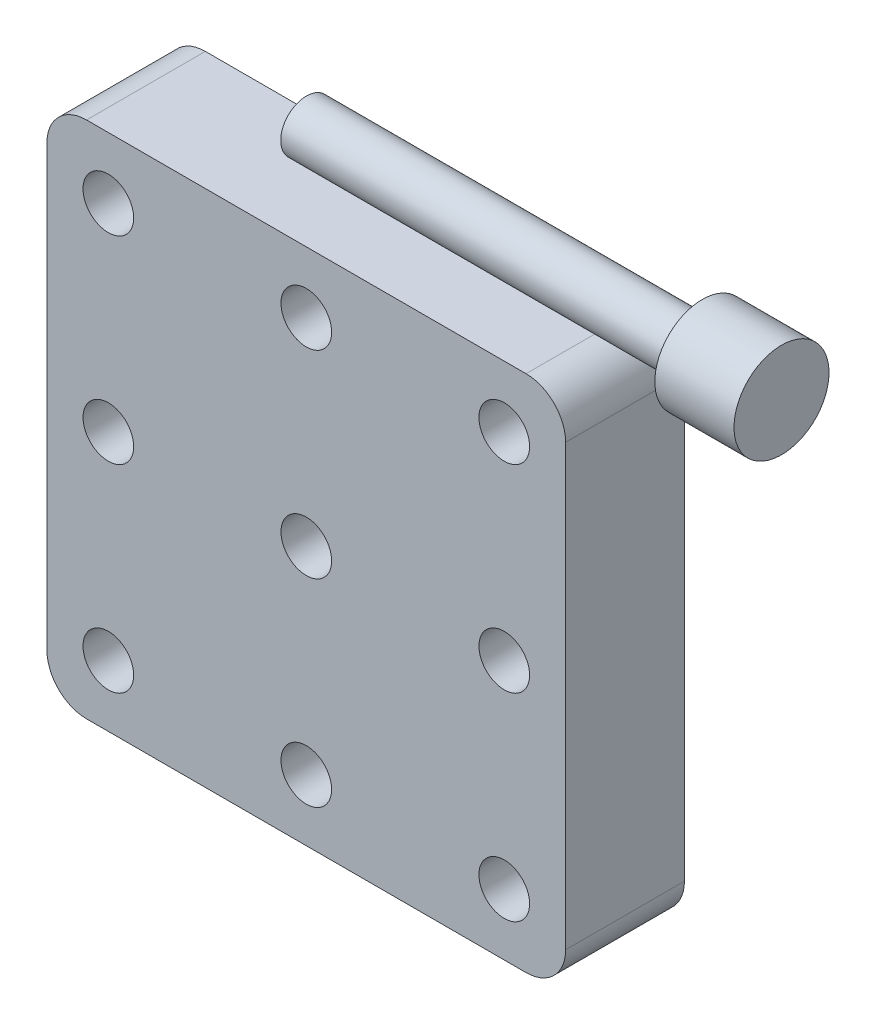
ISO-10303-21;
HEADER;
FILE_DESCRIPTION(('STEP AP214'),'2;1');
FILE_NAME('part.step','',(''),(''),'','','');
FILE_SCHEMA(('AUTOMOTIVE_DESIGN { 1 0 10303 214 1 1 1 1 }'));
ENDSEC;
DATA;
#1=APPLICATION_CONTEXT('core data for automotive mechanical design processes');
#2=APPLICATION_PROTOCOL_DEFINITION('international standard','automotive_design',2000,#1);
#3=PRODUCT_CONTEXT('',#1,'mechanical');
#4=PRODUCT('Part','Part','',(#3));
#5=PRODUCT_RELATED_PRODUCT_CATEGORY('part','',(#4));
#6=PRODUCT_DEFINITION_FORMATION('','',#4);
#7=PRODUCT_DEFINITION_CONTEXT('part definition',#1,'design');
#8=PRODUCT_DEFINITION('design','',#6,#7);
#9=PRODUCT_DEFINITION_SHAPE('','',#8);
#10=(LENGTH_UNIT() NAMED_UNIT(*) SI_UNIT(.MILLI.,.METRE.));
#11=(NAMED_UNIT(*) PLANE_ANGLE_UNIT() SI_UNIT($,.RADIAN.));
#12=(NAMED_UNIT(*) SI_UNIT($,.STERADIAN.) SOLID_ANGLE_UNIT());
#13=UNCERTAINTY_MEASURE_WITH_UNIT(LENGTH_MEASURE(1.E-05),#10,'distance_accuracy_value','');
#14=(GEOMETRIC_REPRESENTATION_CONTEXT(3) GLOBAL_UNCERTAINTY_ASSIGNED_CONTEXT((#13)) GLOBAL_UNIT_ASSIGNED_CONTEXT((#10,
#11,#12)) REPRESENTATION_CONTEXT('',''));
#15=CARTESIAN_POINT('',(0.,0.,0.));
#16=DIRECTION('',(0.,0.,1.));
#17=DIRECTION('',(1.,0.,0.));
#18=AXIS2_PLACEMENT_3D('',#15,#16,#17);
#19=CARTESIAN_POINT('',(-10.,35.9950447421009,9.98803609831382));
#20=DIRECTION('',(1.,0.,0.));
#21=DIRECTION('',(0.,0.,-1.));
#22=AXIS2_PLACEMENT_3D('',#19,#20,#21);
#23=CYLINDRICAL_SURFACE('',#22,3.24504474210088);
#24=CARTESIAN_POINT('',(-10.,35.9950447421009,9.98803609831382));
#25=DIRECTION('',(1.,0.,0.));
#26=DIRECTION('',(0.,0.,-1.));
#27=AXIS2_PLACEMENT_3D('',#24,#25,#26);
#28=CIRCLE('',#27,3.24504474210088);
#29=CARTESIAN_POINT('',(-10.,35.9950447421009,6.74299135621294));
#30=VERTEX_POINT('',#29);
#31=EDGE_CURVE('E11',#30,#30,#28,.T.);
#32=ORIENTED_EDGE('',*,*,#31,.T.);
#33=EDGE_LOOP('',(#32));
#34=FACE_BOUND('',#33,.T.);
#35=CARTESIAN_POINT('',(40.,35.9950447421009,9.98803609831382));
#36=DIRECTION('',(1.,0.,0.));
#37=DIRECTION('',(0.,0.,-1.));
#38=AXIS2_PLACEMENT_3D('',#35,#36,#37);
#39=CIRCLE('',#38,3.24504474210088);
#40=CARTESIAN_POINT('',(40.,35.9950447421009,6.74299135621294));
#41=VERTEX_POINT('',#40);
#42=EDGE_CURVE('E47',#41,#41,#39,.T.);
#43=ORIENTED_EDGE('',*,*,#42,.F.);
#44=EDGE_LOOP('',(#43));
#45=FACE_BOUND('',#44,.T.);
#46=ADVANCED_FACE('F41',(#34,#45),#23,.T.);
#47=CARTESIAN_POINT('',(-10.,35.9950447421009,9.98803609831382));
#48=DIRECTION('',(1.,0.,0.));
#49=DIRECTION('',(0.,0.,-1.));
#50=AXIS2_PLACEMENT_3D('',#47,#48,#49);
#51=PLANE('',#50);
#52=ORIENTED_EDGE('',*,*,#31,.F.);
#53=EDGE_LOOP('',(#52));
#54=FACE_BOUND('',#53,.T.);
#55=ADVANCED_FACE('F74',(#54),#51,.F.);
#56=CARTESIAN_POINT('',(50.,35.9950447421009,9.98803609831382));
#57=DIRECTION('',(-1.,0.,0.));
#58=DIRECTION('',(0.,0.,1.));
#59=AXIS2_PLACEMENT_3D('',#56,#57,#58);
#60=CYLINDRICAL_SURFACE('',#59,6.);
#61=CARTESIAN_POINT('',(50.,35.9950447421009,9.98803609831382));
#62=DIRECTION('',(1.,0.,0.));
#63=DIRECTION('',(0.,0.,-1.));
#64=AXIS2_PLACEMENT_3D('',#61,#62,#63);
#65=CIRCLE('',#64,6.);
#66=CARTESIAN_POINT('',(50.,35.9950447421009,3.98803609831382));
#67=VERTEX_POINT('',#66);
#68=EDGE_CURVE('E51',#67,#67,#65,.T.);
#69=ORIENTED_EDGE('',*,*,#68,.F.);
#70=EDGE_LOOP('',(#69));
#71=FACE_BOUND('',#70,.T.);
#72=CARTESIAN_POINT('',(40.,35.9950447421009,9.98803609831382));
#73=DIRECTION('',(1.,0.,0.));
#74=DIRECTION('',(0.,0.,-1.));
#75=AXIS2_PLACEMENT_3D('',#72,#73,#74);
#76=CIRCLE('',#75,6.);
#77=CARTESIAN_POINT('',(40.,35.9950447421009,3.98803609831382));
#78=VERTEX_POINT('',#77);
#79=EDGE_CURVE('E55',#78,#78,#76,.T.);
#80=ORIENTED_EDGE('',*,*,#79,.T.);
#81=EDGE_LOOP('',(#80));
#82=FACE_BOUND('',#81,.T.);
#83=ADVANCED_FACE('F61',(#71,#82),#60,.T.);
#84=CARTESIAN_POINT('',(50.,35.9950447421009,9.98803609831382));
#85=DIRECTION('',(1.,0.,0.));
#86=DIRECTION('',(0.,0.,-1.));
#87=AXIS2_PLACEMENT_3D('',#84,#85,#86);
#88=PLANE('',#87);
#89=ORIENTED_EDGE('',*,*,#68,.T.);
#90=EDGE_LOOP('',(#89));
#91=FACE_BOUND('',#90,.T.);
#92=ADVANCED_FACE('F65',(#91),#88,.T.);
#93=CARTESIAN_POINT('',(40.,35.9950447421009,9.98803609831382));
#94=DIRECTION('',(1.,0.,0.));
#95=DIRECTION('',(0.,0.,-1.));
#96=AXIS2_PLACEMENT_3D('',#93,#94,#95);
#97=PLANE('',#96);
#98=ORIENTED_EDGE('',*,*,#42,.T.);
#99=EDGE_LOOP('',(#98));
#100=FACE_BOUND('',#99,.T.);
#101=ORIENTED_EDGE('',*,*,#79,.F.);
#102=EDGE_LOOP('',(#101));
#103=FACE_BOUND('',#102,.T.);
#104=ADVANCED_FACE('F63',(#100,#103),#97,.F.);
#105=CLOSED_SHELL('',(#46,#55,#83,#92,#104));
#106=MANIFOLD_SOLID_BREP('B2',#105);
#107=CARTESIAN_POINT('',(-32.75,-32.75,20.));
#108=DIRECTION('',(-1.,0.,0.));
#109=DIRECTION('',(0.,0.,1.));
#110=AXIS2_PLACEMENT_3D('',#107,#108,#109);
#111=PLANE('',#110);
#112=DIRECTION('',(0.,0.,-1.));
#113=VECTOR('',#112,1.);
#114=CARTESIAN_POINT('',(-32.75,27.75,20.));
#115=LINE('',#114,#113);
#116=CARTESIAN_POINT('',(-32.75,27.75,20.));
#117=VERTEX_POINT('',#116);
#118=CARTESIAN_POINT('',(-32.75,27.75,5.));
#119=VERTEX_POINT('',#118);
#120=EDGE_CURVE('E195',#117,#119,#115,.T.);
#121=ORIENTED_EDGE('',*,*,#120,.T.);
#122=DIRECTION('',(0.,1.,0.));
#123=VECTOR('',#122,1.);
#124=CARTESIAN_POINT('',(-32.75,32.75,5.));
#125=LINE('',#124,#123);
#126=CARTESIAN_POINT('',(-32.75,-27.75,5.));
#127=VERTEX_POINT('',#126);
#128=EDGE_CURVE('E127',#127,#119,#125,.T.);
#129=ORIENTED_EDGE('',*,*,#128,.F.);
#130=DIRECTION('',(0.,0.,-1.));
#131=VECTOR('',#130,1.);
#132=CARTESIAN_POINT('',(-32.75,-27.75,20.));
#133=LINE('',#132,#131);
#134=CARTESIAN_POINT('',(-32.75,-27.75,20.));
#135=VERTEX_POINT('',#134);
#136=EDGE_CURVE('E192',#127,#135,#133,.F.);
#137=ORIENTED_EDGE('',*,*,#136,.T.);
#138=DIRECTION('',(0.,1.,0.));
#139=VECTOR('',#138,1.);
#140=CARTESIAN_POINT('',(-32.75,-32.75,20.));
#141=LINE('',#140,#139);
#142=EDGE_CURVE('E226',#135,#117,#141,.T.);
#143=ORIENTED_EDGE('',*,*,#142,.T.);
#144=EDGE_LOOP('',(#121,#129,#137,#143));
#145=FACE_BOUND('',#144,.T.);
#146=ADVANCED_FACE('F112',(#145),#111,.T.);
#147=CARTESIAN_POINT('',(-32.75,-32.75,20.));
#148=DIRECTION('',(0.,1.,0.));
#149=DIRECTION('',(0.,0.,1.));
#150=AXIS2_PLACEMENT_3D('',#147,#148,#149);
#151=PLANE('',#150);
#152=DIRECTION('',(-1.,0.,0.));
#153=VECTOR('',#152,1.);
#154=CARTESIAN_POINT('',(32.75,-32.75,5.));
#155=LINE('',#154,#153);
#156=CARTESIAN_POINT('',(27.75,-32.75,5.));
#157=VERTEX_POINT('',#156);
#158=CARTESIAN_POINT('',(-27.75,-32.75,5.));
#159=VERTEX_POINT('',#158);
#160=EDGE_CURVE('E181',#157,#159,#155,.T.);
#161=ORIENTED_EDGE('',*,*,#160,.F.);
#162=DIRECTION('',(0.,0.,-1.));
#163=VECTOR('',#162,1.);
#164=CARTESIAN_POINT('',(27.75,-32.75,20.));
#165=LINE('',#164,#163);
#166=CARTESIAN_POINT('',(27.75,-32.75,20.));
#167=VERTEX_POINT('',#166);
#168=EDGE_CURVE('E272',#157,#167,#165,.F.);
#169=ORIENTED_EDGE('',*,*,#168,.T.);
#170=DIRECTION('',(1.,0.,0.));
#171=VECTOR('',#170,1.);
#172=CARTESIAN_POINT('',(-32.75,-32.75,20.));
#173=LINE('',#172,#171);
#174=CARTESIAN_POINT('',(-27.75,-32.75,20.));
#175=VERTEX_POINT('',#174);
#176=EDGE_CURVE('E269',#175,#167,#173,.T.);
#177=ORIENTED_EDGE('',*,*,#176,.F.);
#178=DIRECTION('',(0.,0.,-1.));
#179=VECTOR('',#178,1.);
#180=CARTESIAN_POINT('',(-27.75,-32.75,0.));
#181=LINE('',#180,#179);
#182=EDGE_CURVE('E204',#175,#159,#181,.T.);
#183=ORIENTED_EDGE('',*,*,#182,.T.);
#184=EDGE_LOOP('',(#161,#169,#177,#183));
#185=FACE_BOUND('',#184,.T.);
#186=ADVANCED_FACE('F275',(#185),#151,.F.);
#187=CARTESIAN_POINT('',(32.75,-32.75,20.));
#188=DIRECTION('',(-1.,0.,0.));
#189=DIRECTION('',(0.,0.,1.));
#190=AXIS2_PLACEMENT_3D('',#187,#188,#189);
#191=PLANE('',#190);
#192=DIRECTION('',(0.,-1.,0.));
#193=VECTOR('',#192,1.);
#194=CARTESIAN_POINT('',(32.75,32.75,5.));
#195=LINE('',#194,#193);
#196=CARTESIAN_POINT('',(32.75,27.75,5.));
#197=VERTEX_POINT('',#196);
#198=CARTESIAN_POINT('',(32.75,-27.75,5.));
#199=VERTEX_POINT('',#198);
#200=EDGE_CURVE('E285',#197,#199,#195,.T.);
#201=ORIENTED_EDGE('',*,*,#200,.F.);
#202=DIRECTION('',(0.,0.,-1.));
#203=VECTOR('',#202,1.);
#204=CARTESIAN_POINT('',(32.75,27.75,20.));
#205=LINE('',#204,#203);
#206=CARTESIAN_POINT('',(32.75,27.75,20.));
#207=VERTEX_POINT('',#206);
#208=EDGE_CURVE('E212',#197,#207,#205,.F.);
#209=ORIENTED_EDGE('',*,*,#208,.T.);
#210=DIRECTION('',(0.,1.,0.));
#211=VECTOR('',#210,1.);
#212=CARTESIAN_POINT('',(32.75,-32.75,20.));
#213=LINE('',#212,#211);
#214=CARTESIAN_POINT('',(32.75,-27.75,20.));
#215=VERTEX_POINT('',#214);
#216=EDGE_CURVE('E225',#215,#207,#213,.T.);
#217=ORIENTED_EDGE('',*,*,#216,.F.);
#218=DIRECTION('',(0.,0.,-1.));
#219=VECTOR('',#218,1.);
#220=CARTESIAN_POINT('',(32.75,-27.75,20.));
#221=LINE('',#220,#219);
#222=EDGE_CURVE('E214',#215,#199,#221,.T.);
#223=ORIENTED_EDGE('',*,*,#222,.T.);
#224=EDGE_LOOP('',(#201,#209,#217,#223));
#225=FACE_BOUND('',#224,.T.);
#226=ADVANCED_FACE('F284',(#225),#191,.F.);
#227=CARTESIAN_POINT('',(-32.75,32.75,20.));
#228=DIRECTION('',(0.,1.,0.));
#229=DIRECTION('',(0.,0.,1.));
#230=AXIS2_PLACEMENT_3D('',#227,#228,#229);
#231=PLANE('',#230);
#232=DIRECTION('',(0.,0.,-1.));
#233=VECTOR('',#232,1.);
#234=CARTESIAN_POINT('',(27.75,32.75,0.));
#235=LINE('',#234,#233);
#236=CARTESIAN_POINT('',(27.75,32.75,20.));
#237=VERTEX_POINT('',#236);
#238=CARTESIAN_POINT('',(27.75,32.75,5.));
#239=VERTEX_POINT('',#238);
#240=EDGE_CURVE('E39',#237,#239,#235,.T.);
#241=ORIENTED_EDGE('',*,*,#240,.T.);
#242=DIRECTION('',(1.,0.,0.));
#243=VECTOR('',#242,1.);
#244=CARTESIAN_POINT('',(32.75,32.75,5.));
#245=LINE('',#244,#243);
#246=CARTESIAN_POINT('',(-27.75,32.75,5.));
#247=VERTEX_POINT('',#246);
#248=EDGE_CURVE('E196',#247,#239,#245,.T.);
#249=ORIENTED_EDGE('',*,*,#248,.F.);
#250=DIRECTION('',(0.,0.,-1.));
#251=VECTOR('',#250,1.);
#252=CARTESIAN_POINT('',(-27.75,32.75,20.));
#253=LINE('',#252,#251);
#254=CARTESIAN_POINT('',(-27.75,32.75,20.));
#255=VERTEX_POINT('',#254);
#256=EDGE_CURVE('E120',#247,#255,#253,.F.);
#257=ORIENTED_EDGE('',*,*,#256,.T.);
#258=DIRECTION('',(1.,0.,0.));
#259=VECTOR('',#258,1.);
#260=CARTESIAN_POINT('',(-32.75,32.75,20.));
#261=LINE('',#260,#259);
#262=EDGE_CURVE('E220',#255,#237,#261,.T.);
#263=ORIENTED_EDGE('',*,*,#262,.T.);
#264=EDGE_LOOP('',(#241,#249,#257,#263));
#265=FACE_BOUND('',#264,.T.);
#266=ADVANCED_FACE('F219',(#265),#231,.T.);
#267=CARTESIAN_POINT('',(-27.75,-27.75,20.));
#268=DIRECTION('',(0.,0.,1.));
#269=DIRECTION('',(1.,0.,0.));
#270=AXIS2_PLACEMENT_3D('',#267,#268,#269);
#271=CYLINDRICAL_SURFACE('',#270,5.);
#272=ORIENTED_EDGE('',*,*,#136,.F.);
#273=CARTESIAN_POINT('',(-27.75,-27.75,5.));
#274=DIRECTION('',(0.,0.,-1.));
#275=DIRECTION('',(-1.,0.,0.));
#276=AXIS2_PLACEMENT_3D('',#273,#274,#275);
#277=CIRCLE('',#276,5.);
#278=EDGE_CURVE('E177',#127,#159,#277,.F.);
#279=ORIENTED_EDGE('',*,*,#278,.T.);
#280=ORIENTED_EDGE('',*,*,#182,.F.);
#281=CARTESIAN_POINT('',(-27.75,-27.75,20.));
#282=DIRECTION('',(0.,0.,-1.));
#283=DIRECTION('',(-1.,0.,0.));
#284=AXIS2_PLACEMENT_3D('',#281,#282,#283);
#285=CIRCLE('',#284,5.);
#286=EDGE_CURVE('E200',#135,#175,#285,.F.);
#287=ORIENTED_EDGE('',*,*,#286,.F.);
#288=EDGE_LOOP('',(#272,#279,#280,#287));
#289=FACE_BOUND('',#288,.T.);
#290=ADVANCED_FACE('F199',(#289),#271,.T.);
#291=CARTESIAN_POINT('',(27.75,-27.75,20.));
#292=DIRECTION('',(0.,0.,-1.));
#293=DIRECTION('',(-1.,0.,0.));
#294=AXIS2_PLACEMENT_3D('',#291,#292,#293);
#295=CYLINDRICAL_SURFACE('',#294,5.);
#296=ORIENTED_EDGE('',*,*,#168,.F.);
#297=CARTESIAN_POINT('',(27.75,-27.75,5.));
#298=DIRECTION('',(0.,0.,-1.));
#299=DIRECTION('',(-1.,0.,0.));
#300=AXIS2_PLACEMENT_3D('',#297,#298,#299);
#301=CIRCLE('',#300,5.);
#302=EDGE_CURVE('E187',#157,#199,#301,.F.);
#303=ORIENTED_EDGE('',*,*,#302,.T.);
#304=ORIENTED_EDGE('',*,*,#222,.F.);
#305=CARTESIAN_POINT('',(27.75,-27.75,20.));
#306=DIRECTION('',(0.,0.,-1.));
#307=DIRECTION('',(-1.,0.,0.));
#308=AXIS2_PLACEMENT_3D('',#305,#306,#307);
#309=CIRCLE('',#308,5.);
#310=EDGE_CURVE('E209',#167,#215,#309,.F.);
#311=ORIENTED_EDGE('',*,*,#310,.F.);
#312=EDGE_LOOP('',(#296,#303,#304,#311));
#313=FACE_BOUND('',#312,.T.);
#314=ADVANCED_FACE('F281',(#313),#295,.T.);
#315=CARTESIAN_POINT('',(27.75,27.75,20.));
#316=DIRECTION('',(0.,0.,1.));
#317=DIRECTION('',(1.,0.,0.));
#318=AXIS2_PLACEMENT_3D('',#315,#316,#317);
#319=CYLINDRICAL_SURFACE('',#318,5.);
#320=ORIENTED_EDGE('',*,*,#208,.F.);
#321=CARTESIAN_POINT('',(27.75,27.75,5.));
#322=DIRECTION('',(0.,0.,-1.));
#323=DIRECTION('',(-1.,0.,0.));
#324=AXIS2_PLACEMENT_3D('',#321,#322,#323);
#325=CIRCLE('',#324,5.);
#326=EDGE_CURVE('E229',#197,#239,#325,.F.);
#327=ORIENTED_EDGE('',*,*,#326,.T.);
#328=ORIENTED_EDGE('',*,*,#240,.F.);
#329=CARTESIAN_POINT('',(27.75,27.75,20.));
#330=DIRECTION('',(0.,0.,-1.));
#331=DIRECTION('',(-1.,0.,0.));
#332=AXIS2_PLACEMENT_3D('',#329,#330,#331);
#333=CIRCLE('',#332,5.);
#334=EDGE_CURVE('E135',#207,#237,#333,.F.);
#335=ORIENTED_EDGE('',*,*,#334,.F.);
#336=EDGE_LOOP('',(#320,#327,#328,#335));
#337=FACE_BOUND('',#336,.T.);
#338=ADVANCED_FACE('F288',(#337),#319,.T.);
#339=CARTESIAN_POINT('',(-27.75,27.75,20.));
#340=DIRECTION('',(0.,0.,-1.));
#341=DIRECTION('',(-1.,0.,0.));
#342=AXIS2_PLACEMENT_3D('',#339,#340,#341);
#343=CYLINDRICAL_SURFACE('',#342,5.);
#344=ORIENTED_EDGE('',*,*,#256,.F.);
#345=CARTESIAN_POINT('',(-27.75,27.75,5.));
#346=DIRECTION('',(0.,0.,-1.));
#347=DIRECTION('',(-1.,0.,0.));
#348=AXIS2_PLACEMENT_3D('',#345,#346,#347);
#349=CIRCLE('',#348,5.);
#350=EDGE_CURVE('E228',#247,#119,#349,.F.);
#351=ORIENTED_EDGE('',*,*,#350,.T.);
#352=ORIENTED_EDGE('',*,*,#120,.F.);
#353=CARTESIAN_POINT('',(-27.75,27.75,20.));
#354=DIRECTION('',(0.,0.,-1.));
#355=DIRECTION('',(-1.,0.,0.));
#356=AXIS2_PLACEMENT_3D('',#353,#354,#355);
#357=CIRCLE('',#356,5.);
#358=EDGE_CURVE('E201',#255,#117,#357,.F.);
#359=ORIENTED_EDGE('',*,*,#358,.F.);
#360=EDGE_LOOP('',(#344,#351,#352,#359));
#361=FACE_BOUND('',#360,.T.);
#362=ADVANCED_FACE('F114',(#361),#343,.T.);
#363=CARTESIAN_POINT('',(25.,-25.,5.));
#364=DIRECTION('',(0.,0.,-1.));
#365=DIRECTION('',(-1.,0.,0.));
#366=AXIS2_PLACEMENT_3D('',#363,#364,#365);
#367=CYLINDRICAL_SURFACE('',#366,3.2);
#368=CARTESIAN_POINT('',(25.,-25.,20.));
#369=DIRECTION('',(0.,0.,1.));
#370=DIRECTION('',(1.,0.,0.));
#371=AXIS2_PLACEMENT_3D('',#368,#369,#370);
#372=CIRCLE('',#371,3.2);
#373=CARTESIAN_POINT('',(28.2,-25.,20.));
#374=VERTEX_POINT('',#373);
#375=EDGE_CURVE('E256',#374,#374,#372,.T.);
#376=ORIENTED_EDGE('',*,*,#375,.T.);
#377=EDGE_LOOP('',(#376));
#378=FACE_BOUND('',#377,.T.);
#379=CARTESIAN_POINT('',(25.,-25.,5.));
#380=DIRECTION('',(0.,0.,-1.));
#381=DIRECTION('',(-1.,0.,0.));
#382=AXIS2_PLACEMENT_3D('',#379,#380,#381);
#383=CIRCLE('',#382,3.2);
#384=CARTESIAN_POINT('',(21.8,-25.,5.));
#385=VERTEX_POINT('',#384);
#386=EDGE_CURVE('E230',#385,#385,#383,.F.);
#387=ORIENTED_EDGE('',*,*,#386,.F.);
#388=EDGE_LOOP('',(#387));
#389=FACE_BOUND('',#388,.T.);
#390=ADVANCED_FACE('F320',(#378,#389),#367,.F.);
#391=CARTESIAN_POINT('',(25.,25.,5.));
#392=DIRECTION('',(0.,0.,-1.));
#393=DIRECTION('',(-1.,0.,0.));
#394=AXIS2_PLACEMENT_3D('',#391,#392,#393);
#395=CYLINDRICAL_SURFACE('',#394,3.2);
#396=CARTESIAN_POINT('',(25.,25.,20.));
#397=DIRECTION('',(0.,0.,1.));
#398=DIRECTION('',(1.,0.,0.));
#399=AXIS2_PLACEMENT_3D('',#396,#397,#398);
#400=CIRCLE('',#399,3.2);
#401=CARTESIAN_POINT('',(28.2,25.,20.));
#402=VERTEX_POINT('',#401);
#403=EDGE_CURVE('E253',#402,#402,#400,.T.);
#404=ORIENTED_EDGE('',*,*,#403,.T.);
#405=EDGE_LOOP('',(#404));
#406=FACE_BOUND('',#405,.T.);
#407=CARTESIAN_POINT('',(25.,25.,5.));
#408=DIRECTION('',(0.,0.,-1.));
#409=DIRECTION('',(-1.,0.,0.));
#410=AXIS2_PLACEMENT_3D('',#407,#408,#409);
#411=CIRCLE('',#410,3.2);
#412=CARTESIAN_POINT('',(21.8,25.,5.));
#413=VERTEX_POINT('',#412);
#414=EDGE_CURVE('E235',#413,#413,#411,.F.);
#415=ORIENTED_EDGE('',*,*,#414,.F.);
#416=EDGE_LOOP('',(#415));
#417=FACE_BOUND('',#416,.T.);
#418=ADVANCED_FACE('F318',(#406,#417),#395,.F.);
#419=CARTESIAN_POINT('',(0.,0.,20.));
#420=DIRECTION('',(0.,0.,-1.));
#421=DIRECTION('',(-1.,0.,0.));
#422=AXIS2_PLACEMENT_3D('',#419,#420,#421);
#423=PLANE('',#422);
#424=CARTESIAN_POINT('',(0.,-1.87822334690851E-13,20.));
#425=DIRECTION('',(0.,0.,1.));
#426=DIRECTION('',(1.,0.,0.));
#427=AXIS2_PLACEMENT_3D('',#424,#425,#426);
#428=CIRCLE('',#427,3.2);
#429=CARTESIAN_POINT('',(3.19999999999999,-1.87822334690851E-13,20.));
#430=VERTEX_POINT('',#429);
#431=EDGE_CURVE('E247',#430,#430,#428,.T.);
#432=ORIENTED_EDGE('',*,*,#431,.F.);
#433=EDGE_LOOP('',(#432));
#434=FACE_BOUND('',#433,.T.);
#435=CARTESIAN_POINT('',(-25.,-25.0000000000004,20.));
#436=DIRECTION('',(0.,0.,1.));
#437=DIRECTION('',(1.,0.,0.));
#438=AXIS2_PLACEMENT_3D('',#435,#436,#437);
#439=CIRCLE('',#438,3.2);
#440=CARTESIAN_POINT('',(-21.8,-25.0000000000004,20.));
#441=VERTEX_POINT('',#440);
#442=EDGE_CURVE('E244',#441,#441,#439,.T.);
#443=ORIENTED_EDGE('',*,*,#442,.F.);
#444=EDGE_LOOP('',(#443));
#445=FACE_BOUND('',#444,.T.);
#446=CARTESIAN_POINT('',(-25.,24.9999999999997,20.));
#447=DIRECTION('',(0.,0.,1.));
#448=DIRECTION('',(1.,0.,0.));
#449=AXIS2_PLACEMENT_3D('',#446,#447,#448);
#450=CIRCLE('',#449,3.2);
#451=CARTESIAN_POINT('',(-21.8,24.9999999999997,20.));
#452=VERTEX_POINT('',#451);
#453=EDGE_CURVE('E241',#452,#452,#450,.T.);
#454=ORIENTED_EDGE('',*,*,#453,.F.);
#455=EDGE_LOOP('',(#454));
#456=FACE_BOUND('',#455,.T.);
#457=CARTESIAN_POINT('',(-25.,-3.62396401633008E-13,20.));
#458=DIRECTION('',(0.,0.,1.));
#459=DIRECTION('',(1.,0.,0.));
#460=AXIS2_PLACEMENT_3D('',#457,#458,#459);
#461=CIRCLE('',#460,3.2);
#462=CARTESIAN_POINT('',(-21.8,-3.62396401633008E-13,20.));
#463=VERTEX_POINT('',#462);
#464=EDGE_CURVE('E186',#463,#463,#461,.T.);
#465=ORIENTED_EDGE('',*,*,#464,.F.);
#466=EDGE_LOOP('',(#465));
#467=FACE_BOUND('',#466,.T.);
#468=CARTESIAN_POINT('',(0.,24.9999999999998,20.));
#469=DIRECTION('',(0.,0.,1.));
#470=DIRECTION('',(1.,0.,0.));
#471=AXIS2_PLACEMENT_3D('',#468,#469,#470);
#472=CIRCLE('',#471,3.2);
#473=CARTESIAN_POINT('',(3.19999999999999,24.9999999999998,20.));
#474=VERTEX_POINT('',#473);
#475=EDGE_CURVE('E250',#474,#474,#472,.T.);
#476=ORIENTED_EDGE('',*,*,#475,.F.);
#477=EDGE_LOOP('',(#476));
#478=FACE_BOUND('',#477,.T.);
#479=CARTESIAN_POINT('',(0.,-25.0000000000002,20.));
#480=DIRECTION('',(0.,0.,1.));
#481=DIRECTION('',(1.,0.,0.));
#482=AXIS2_PLACEMENT_3D('',#479,#480,#481);
#483=CIRCLE('',#482,3.2);
#484=CARTESIAN_POINT('',(3.19999999999999,-25.0000000000002,20.));
#485=VERTEX_POINT('',#484);
#486=EDGE_CURVE('E260',#485,#485,#483,.T.);
#487=ORIENTED_EDGE('',*,*,#486,.F.);
#488=EDGE_LOOP('',(#487));
#489=FACE_BOUND('',#488,.T.);
#490=CARTESIAN_POINT('',(25.,0.,20.));
#491=DIRECTION('',(0.,0.,1.));
#492=DIRECTION('',(1.,0.,0.));
#493=AXIS2_PLACEMENT_3D('',#490,#491,#492);
#494=CIRCLE('',#493,3.2);
#495=CARTESIAN_POINT('',(28.2,0.,20.));
#496=VERTEX_POINT('',#495);
#497=EDGE_CURVE('E257',#496,#496,#494,.T.);
#498=ORIENTED_EDGE('',*,*,#497,.F.);
#499=EDGE_LOOP('',(#498));
#500=FACE_BOUND('',#499,.T.);
#501=ORIENTED_EDGE('',*,*,#403,.F.);
#502=EDGE_LOOP('',(#501));
#503=FACE_BOUND('',#502,.T.);
#504=ORIENTED_EDGE('',*,*,#375,.F.);
#505=EDGE_LOOP('',(#504));
#506=FACE_BOUND('',#505,.T.);
#507=ORIENTED_EDGE('',*,*,#142,.F.);
#508=ORIENTED_EDGE('',*,*,#286,.T.);
#509=ORIENTED_EDGE('',*,*,#176,.T.);
#510=ORIENTED_EDGE('',*,*,#310,.T.);
#511=ORIENTED_EDGE('',*,*,#216,.T.);
#512=ORIENTED_EDGE('',*,*,#334,.T.);
#513=ORIENTED_EDGE('',*,*,#262,.F.);
#514=ORIENTED_EDGE('',*,*,#358,.T.);
#515=EDGE_LOOP('',(#507,#508,#509,#510,#511,#512,#513,#514));
#516=FACE_BOUND('',#515,.T.);
#517=ADVANCED_FACE('F224',(#434,#445,#456,#467,#478,#489,#500,#503,#506,#516),#423,.F.);
#518=CARTESIAN_POINT('',(25.,0.,5.));
#519=DIRECTION('',(0.,0.,1.));
#520=DIRECTION('',(1.,0.,0.));
#521=AXIS2_PLACEMENT_3D('',#518,#519,#520);
#522=CYLINDRICAL_SURFACE('',#521,3.2);
#523=CARTESIAN_POINT('',(25.,0.,5.));
#524=DIRECTION('',(0.,0.,-1.));
#525=DIRECTION('',(-1.,0.,0.));
#526=AXIS2_PLACEMENT_3D('',#523,#524,#525);
#527=CIRCLE('',#526,3.2);
#528=CARTESIAN_POINT('',(21.8,0.,5.));
#529=VERTEX_POINT('',#528);
#530=EDGE_CURVE('E311',#529,#529,#527,.F.);
#531=ORIENTED_EDGE('',*,*,#530,.F.);
#532=EDGE_LOOP('',(#531));
#533=FACE_BOUND('',#532,.T.);
#534=ORIENTED_EDGE('',*,*,#497,.T.);
#535=EDGE_LOOP('',(#534));
#536=FACE_BOUND('',#535,.T.);
#537=ADVANCED_FACE('F327',(#533,#536),#522,.F.);
#538=CARTESIAN_POINT('',(0.,-25.0000000000002,5.));
#539=DIRECTION('',(0.,0.,1.));
#540=DIRECTION('',(1.,0.,0.));
#541=AXIS2_PLACEMENT_3D('',#538,#539,#540);
#542=CYLINDRICAL_SURFACE('',#541,3.2);
#543=CARTESIAN_POINT('',(0.,-25.0000000000002,5.));
#544=DIRECTION('',(0.,0.,-1.));
#545=DIRECTION('',(-1.,0.,0.));
#546=AXIS2_PLACEMENT_3D('',#543,#544,#545);
#547=CIRCLE('',#546,3.2);
#548=CARTESIAN_POINT('',(-3.20000000000002,-25.0000000000002,5.));
#549=VERTEX_POINT('',#548);
#550=EDGE_CURVE('E308',#549,#549,#547,.F.);
#551=ORIENTED_EDGE('',*,*,#550,.F.);
#552=EDGE_LOOP('',(#551));
#553=FACE_BOUND('',#552,.T.);
#554=ORIENTED_EDGE('',*,*,#486,.T.);
#555=EDGE_LOOP('',(#554));
#556=FACE_BOUND('',#555,.T.);
#557=ADVANCED_FACE('F411',(#553,#556),#542,.F.);
#558=CARTESIAN_POINT('',(0.,24.9999999999998,5.));
#559=DIRECTION('',(0.,0.,1.));
#560=DIRECTION('',(1.,0.,0.));
#561=AXIS2_PLACEMENT_3D('',#558,#559,#560);
#562=CYLINDRICAL_SURFACE('',#561,3.2);
#563=CARTESIAN_POINT('',(0.,24.9999999999998,5.));
#564=DIRECTION('',(0.,0.,-1.));
#565=DIRECTION('',(-1.,0.,0.));
#566=AXIS2_PLACEMENT_3D('',#563,#564,#565);
#567=CIRCLE('',#566,3.2);
#568=CARTESIAN_POINT('',(-3.20000000000002,24.9999999999998,5.));
#569=VERTEX_POINT('',#568);
#570=EDGE_CURVE('E305',#569,#569,#567,.F.);
#571=ORIENTED_EDGE('',*,*,#570,.F.);
#572=EDGE_LOOP('',(#571));
#573=FACE_BOUND('',#572,.T.);
#574=ORIENTED_EDGE('',*,*,#475,.T.);
#575=EDGE_LOOP('',(#574));
#576=FACE_BOUND('',#575,.T.);
#577=ADVANCED_FACE('F403',(#573,#576),#562,.F.);
#578=CARTESIAN_POINT('',(-25.,-3.62396401633008E-13,5.));
#579=DIRECTION('',(0.,0.,1.));
#580=DIRECTION('',(1.,0.,0.));
#581=AXIS2_PLACEMENT_3D('',#578,#579,#580);
#582=CYLINDRICAL_SURFACE('',#581,3.2);
#583=CARTESIAN_POINT('',(-25.,-3.62396401633008E-13,5.));
#584=DIRECTION('',(0.,0.,-1.));
#585=DIRECTION('',(-1.,0.,0.));
#586=AXIS2_PLACEMENT_3D('',#583,#584,#585);
#587=CIRCLE('',#586,3.2);
#588=CARTESIAN_POINT('',(-28.2,-3.62396401633008E-13,5.));
#589=VERTEX_POINT('',#588);
#590=EDGE_CURVE('E302',#589,#589,#587,.F.);
#591=ORIENTED_EDGE('',*,*,#590,.F.);
#592=EDGE_LOOP('',(#591));
#593=FACE_BOUND('',#592,.T.);
#594=ORIENTED_EDGE('',*,*,#464,.T.);
#595=EDGE_LOOP('',(#594));
#596=FACE_BOUND('',#595,.T.);
#597=ADVANCED_FACE('F395',(#593,#596),#582,.F.);
#598=CARTESIAN_POINT('',(-25.,24.9999999999997,5.));
#599=DIRECTION('',(0.,0.,1.));
#600=DIRECTION('',(1.,0.,0.));
#601=AXIS2_PLACEMENT_3D('',#598,#599,#600);
#602=CYLINDRICAL_SURFACE('',#601,3.2);
#603=CARTESIAN_POINT('',(-25.,24.9999999999997,5.));
#604=DIRECTION('',(0.,0.,-1.));
#605=DIRECTION('',(-1.,0.,0.));
#606=AXIS2_PLACEMENT_3D('',#603,#604,#605);
#607=CIRCLE('',#606,3.2);
#608=CARTESIAN_POINT('',(-28.2,24.9999999999997,5.));
#609=VERTEX_POINT('',#608);
#610=EDGE_CURVE('E299',#609,#609,#607,.F.);
#611=ORIENTED_EDGE('',*,*,#610,.F.);
#612=EDGE_LOOP('',(#611));
#613=FACE_BOUND('',#612,.T.);
#614=ORIENTED_EDGE('',*,*,#453,.T.);
#615=EDGE_LOOP('',(#614));
#616=FACE_BOUND('',#615,.T.);
#617=ADVANCED_FACE('F387',(#613,#616),#602,.F.);
#618=CARTESIAN_POINT('',(-25.,-25.0000000000004,5.));
#619=DIRECTION('',(0.,0.,1.));
#620=DIRECTION('',(1.,0.,0.));
#621=AXIS2_PLACEMENT_3D('',#618,#619,#620);
#622=CYLINDRICAL_SURFACE('',#621,3.2);
#623=CARTESIAN_POINT('',(-25.,-25.0000000000004,5.));
#624=DIRECTION('',(0.,0.,-1.));
#625=DIRECTION('',(-1.,0.,0.));
#626=AXIS2_PLACEMENT_3D('',#623,#624,#625);
#627=CIRCLE('',#626,3.2);
#628=CARTESIAN_POINT('',(-28.2,-25.0000000000004,5.));
#629=VERTEX_POINT('',#628);
#630=EDGE_CURVE('E296',#629,#629,#627,.F.);
#631=ORIENTED_EDGE('',*,*,#630,.F.);
#632=EDGE_LOOP('',(#631));
#633=FACE_BOUND('',#632,.T.);
#634=ORIENTED_EDGE('',*,*,#442,.T.);
#635=EDGE_LOOP('',(#634));
#636=FACE_BOUND('',#635,.T.);
#637=ADVANCED_FACE('F379',(#633,#636),#622,.F.);
#638=CARTESIAN_POINT('',(0.,-1.87822334690851E-13,5.));
#639=DIRECTION('',(0.,0.,1.));
#640=DIRECTION('',(1.,0.,0.));
#641=AXIS2_PLACEMENT_3D('',#638,#639,#640);
#642=CYLINDRICAL_SURFACE('',#641,3.2);
#643=CARTESIAN_POINT('',(0.,-1.87822334690851E-13,5.));
#644=DIRECTION('',(0.,0.,-1.));
#645=DIRECTION('',(-1.,0.,0.));
#646=AXIS2_PLACEMENT_3D('',#643,#644,#645);
#647=CIRCLE('',#646,3.2);
#648=CARTESIAN_POINT('',(-3.20000000000002,-1.87822334690851E-13,5.));
#649=VERTEX_POINT('',#648);
#650=EDGE_CURVE('E293',#649,#649,#647,.F.);
#651=ORIENTED_EDGE('',*,*,#650,.F.);
#652=EDGE_LOOP('',(#651));
#653=FACE_BOUND('',#652,.T.);
#654=ORIENTED_EDGE('',*,*,#431,.T.);
#655=EDGE_LOOP('',(#654));
#656=FACE_BOUND('',#655,.T.);
#657=ADVANCED_FACE('F369',(#653,#656),#642,.F.);
#658=CARTESIAN_POINT('',(0.,0.,5.));
#659=DIRECTION('',(0.,0.,-1.));
#660=DIRECTION('',(-1.,0.,0.));
#661=AXIS2_PLACEMENT_3D('',#658,#659,#660);
#662=PLANE('',#661);
#663=ORIENTED_EDGE('',*,*,#128,.T.);
#664=ORIENTED_EDGE('',*,*,#350,.F.);
#665=ORIENTED_EDGE('',*,*,#248,.T.);
#666=ORIENTED_EDGE('',*,*,#326,.F.);
#667=ORIENTED_EDGE('',*,*,#200,.T.);
#668=ORIENTED_EDGE('',*,*,#302,.F.);
#669=ORIENTED_EDGE('',*,*,#160,.T.);
#670=ORIENTED_EDGE('',*,*,#278,.F.);
#671=EDGE_LOOP('',(#663,#664,#665,#666,#667,#668,#669,#670));
#672=FACE_BOUND('',#671,.T.);
#673=ORIENTED_EDGE('',*,*,#650,.T.);
#674=EDGE_LOOP('',(#673));
#675=FACE_BOUND('',#674,.T.);
#676=ORIENTED_EDGE('',*,*,#630,.T.);
#677=EDGE_LOOP('',(#676));
#678=FACE_BOUND('',#677,.T.);
#679=ORIENTED_EDGE('',*,*,#610,.T.);
#680=EDGE_LOOP('',(#679));
#681=FACE_BOUND('',#680,.T.);
#682=ORIENTED_EDGE('',*,*,#590,.T.);
#683=EDGE_LOOP('',(#682));
#684=FACE_BOUND('',#683,.T.);
#685=ORIENTED_EDGE('',*,*,#570,.T.);
#686=EDGE_LOOP('',(#685));
#687=FACE_BOUND('',#686,.T.);
#688=ORIENTED_EDGE('',*,*,#550,.T.);
#689=EDGE_LOOP('',(#688));
#690=FACE_BOUND('',#689,.T.);
#691=ORIENTED_EDGE('',*,*,#530,.T.);
#692=EDGE_LOOP('',(#691));
#693=FACE_BOUND('',#692,.T.);
#694=ORIENTED_EDGE('',*,*,#414,.T.);
#695=EDGE_LOOP('',(#694));
#696=FACE_BOUND('',#695,.T.);
#697=ORIENTED_EDGE('',*,*,#386,.T.);
#698=EDGE_LOOP('',(#697));
#699=FACE_BOUND('',#698,.T.);
#700=ADVANCED_FACE('F178',(#672,#675,#678,#681,#684,#687,#690,#693,#696,#699),#662,.T.);
#701=CLOSED_SHELL('',(#146,#186,#226,#266,#290,#314,#338,#362,#390,#418,#517,#537,#557,#577,
#597,#617,#637,#657,#700));
#702=MANIFOLD_SOLID_BREP('B6',#701);
#703=ADVANCED_BREP_SHAPE_REPRESENTATION('',(#18,#106,#702),#14);
#704=SHAPE_DEFINITION_REPRESENTATION(#9,#703);
ENDSEC;
END-ISO-10303-21;
